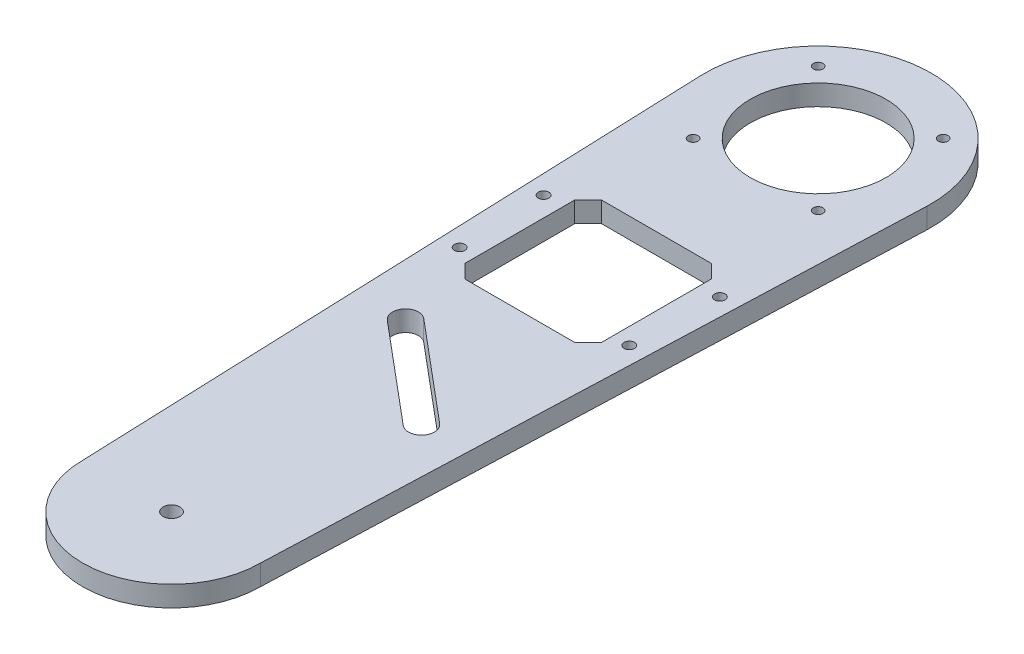
ISO-10303-21;
HEADER;
FILE_DESCRIPTION(('STEP AP214'),'2;1');
FILE_NAME('part.step','',(''),(''),'','','');
FILE_SCHEMA(('AUTOMOTIVE_DESIGN { 1 0 10303 214 1 1 1 1 }'));
ENDSEC;
DATA;
#1=APPLICATION_CONTEXT('core data for automotive mechanical design processes');
#2=APPLICATION_PROTOCOL_DEFINITION('international standard','automotive_design',2000,#1);
#3=PRODUCT_CONTEXT('',#1,'mechanical');
#4=PRODUCT('Part','Part','',(#3));
#5=PRODUCT_RELATED_PRODUCT_CATEGORY('part','',(#4));
#6=PRODUCT_DEFINITION_FORMATION('','',#4);
#7=PRODUCT_DEFINITION_CONTEXT('part definition',#1,'design');
#8=PRODUCT_DEFINITION('design','',#6,#7);
#9=PRODUCT_DEFINITION_SHAPE('','',#8);
#10=(LENGTH_UNIT() NAMED_UNIT(*) SI_UNIT(.MILLI.,.METRE.));
#11=(NAMED_UNIT(*) PLANE_ANGLE_UNIT() SI_UNIT($,.RADIAN.));
#12=(NAMED_UNIT(*) SI_UNIT($,.STERADIAN.) SOLID_ANGLE_UNIT());
#13=UNCERTAINTY_MEASURE_WITH_UNIT(LENGTH_MEASURE(1.E-05),#10,'distance_accuracy_value','');
#14=(GEOMETRIC_REPRESENTATION_CONTEXT(3) GLOBAL_UNCERTAINTY_ASSIGNED_CONTEXT((#13)) GLOBAL_UNIT_ASSIGNED_CONTEXT((#10,
#11,#12)) REPRESENTATION_CONTEXT('',''));
#15=CARTESIAN_POINT('',(0.,0.,0.));
#16=DIRECTION('',(0.,0.,1.));
#17=DIRECTION('',(1.,0.,0.));
#18=AXIS2_PLACEMENT_3D('',#15,#16,#17);
#19=CARTESIAN_POINT('',(27.4611273571522,6.35,1.03319242929476));
#20=DIRECTION('',(-0.999292974733131,0.,-0.0375972159741946));
#21=DIRECTION('',(-0.0375972159741946,0.,0.999292974733131));
#22=AXIS2_PLACEMENT_3D('',#19,#20,#21);
#23=PLANE('',#22);
#24=DIRECTION('',(0.0375972159741946,0.,-0.999292974733131));
#25=VECTOR('',#24,1.);
#26=CARTESIAN_POINT('',(27.4611273571522,0.,1.03319242929476));
#27=LINE('',#26,#25);
#28=CARTESIAN_POINT('',(27.5,0.,0.));
#29=VERTEX_POINT('',#28);
#30=CARTESIAN_POINT('',(34.9752541156596,0.,-198.684097440903));
#31=VERTEX_POINT('',#30);
#32=EDGE_CURVE('E312',#29,#31,#27,.T.);
#33=ORIENTED_EDGE('',*,*,#32,.T.);
#34=DIRECTION('',(0.,-1.,0.));
#35=VECTOR('',#34,1.);
#36=CARTESIAN_POINT('',(34.9752541156596,6.35,-198.684097440903));
#37=LINE('',#36,#35);
#38=CARTESIAN_POINT('',(34.9752541156596,6.35,-198.684097440903));
#39=VERTEX_POINT('',#38);
#40=EDGE_CURVE('E12',#39,#31,#37,.T.);
#41=ORIENTED_EDGE('',*,*,#40,.F.);
#42=DIRECTION('',(0.0375972159741946,0.,-0.999292974733131));
#43=VECTOR('',#42,1.);
#44=CARTESIAN_POINT('',(27.4611273571522,6.35,1.03319242929476));
#45=LINE('',#44,#43);
#46=CARTESIAN_POINT('',(27.5,6.35,0.));
#47=VERTEX_POINT('',#46);
#48=EDGE_CURVE('E318',#47,#39,#45,.T.);
#49=ORIENTED_EDGE('',*,*,#48,.F.);
#50=DIRECTION('',(0.,-1.,0.));
#51=VECTOR('',#50,1.);
#52=CARTESIAN_POINT('',(27.5,6.35,0.));
#53=LINE('',#52,#51);
#54=EDGE_CURVE('E336',#47,#29,#53,.T.);
#55=ORIENTED_EDGE('',*,*,#54,.T.);
#56=EDGE_LOOP('',(#33,#41,#49,#55));
#57=FACE_BOUND('',#56,.T.);
#58=ADVANCED_FACE('F44',(#57),#23,.F.);
#59=CARTESIAN_POINT('',(0.,6.35,-200.));
#60=DIRECTION('',(0.,-1.,0.));
#61=DIRECTION('',(0.,0.,-1.));
#62=AXIS2_PLACEMENT_3D('',#59,#60,#61);
#63=CYLINDRICAL_SURFACE('',#62,35.);
#64=CARTESIAN_POINT('',(0.,0.,-200.));
#65=DIRECTION('',(0.,1.,0.));
#66=DIRECTION('',(0.,0.,1.));
#67=AXIS2_PLACEMENT_3D('',#64,#65,#66);
#68=CIRCLE('',#67,35.);
#69=CARTESIAN_POINT('',(-34.9752541156596,0.,-198.684097440903));
#70=VERTEX_POINT('',#69);
#71=EDGE_CURVE('E340',#31,#70,#68,.T.);
#72=ORIENTED_EDGE('',*,*,#71,.T.);
#73=DIRECTION('',(0.,-1.,0.));
#74=VECTOR('',#73,1.);
#75=CARTESIAN_POINT('',(-34.9752541156596,6.35,-198.684097440903));
#76=LINE('',#75,#74);
#77=CARTESIAN_POINT('',(-34.9752541156596,6.35,-198.684097440903));
#78=VERTEX_POINT('',#77);
#79=EDGE_CURVE('E52',#78,#70,#76,.T.);
#80=ORIENTED_EDGE('',*,*,#79,.F.);
#81=CARTESIAN_POINT('',(0.,6.35,-200.));
#82=DIRECTION('',(0.,1.,0.));
#83=DIRECTION('',(0.,0.,1.));
#84=AXIS2_PLACEMENT_3D('',#81,#82,#83);
#85=CIRCLE('',#84,35.);
#86=EDGE_CURVE('E323',#39,#78,#85,.T.);
#87=ORIENTED_EDGE('',*,*,#86,.F.);
#88=ORIENTED_EDGE('',*,*,#40,.T.);
#89=EDGE_LOOP('',(#72,#80,#87,#88));
#90=FACE_BOUND('',#89,.T.);
#91=ADVANCED_FACE('F362',(#90),#63,.T.);
#92=CARTESIAN_POINT('',(-27.4611273571522,6.35,1.03319242929476));
#93=DIRECTION('',(-0.999292974733131,0.,0.0375972159741946));
#94=DIRECTION('',(0.0375972159741946,0.,0.999292974733131));
#95=AXIS2_PLACEMENT_3D('',#92,#93,#94);
#96=PLANE('',#95);
#97=DIRECTION('',(-0.0375972159741946,0.,-0.999292974733131));
#98=VECTOR('',#97,1.);
#99=CARTESIAN_POINT('',(-27.4611273571522,0.,1.03319242929476));
#100=LINE('',#99,#98);
#101=CARTESIAN_POINT('',(-27.5,0.,0.));
#102=VERTEX_POINT('',#101);
#103=EDGE_CURVE('E344',#102,#70,#100,.T.);
#104=ORIENTED_EDGE('',*,*,#103,.F.);
#105=DIRECTION('',(0.,-1.,0.));
#106=VECTOR('',#105,1.);
#107=CARTESIAN_POINT('',(-27.5,6.35,0.));
#108=LINE('',#107,#106);
#109=CARTESIAN_POINT('',(-27.5,6.35,0.));
#110=VERTEX_POINT('',#109);
#111=EDGE_CURVE('E353',#110,#102,#108,.T.);
#112=ORIENTED_EDGE('',*,*,#111,.F.);
#113=DIRECTION('',(-0.0375972159741946,0.,-0.999292974733131));
#114=VECTOR('',#113,1.);
#115=CARTESIAN_POINT('',(-27.4611273571522,6.35,1.03319242929476));
#116=LINE('',#115,#114);
#117=EDGE_CURVE('E328',#110,#78,#116,.T.);
#118=ORIENTED_EDGE('',*,*,#117,.T.);
#119=ORIENTED_EDGE('',*,*,#79,.T.);
#120=EDGE_LOOP('',(#104,#112,#118,#119));
#121=FACE_BOUND('',#120,.T.);
#122=ADVANCED_FACE('F359',(#121),#96,.T.);
#123=CARTESIAN_POINT('',(0.,6.35,0.));
#124=DIRECTION('',(0.,-1.,0.));
#125=DIRECTION('',(0.,0.,-1.));
#126=AXIS2_PLACEMENT_3D('',#123,#124,#125);
#127=CYLINDRICAL_SURFACE('',#126,27.5);
#128=CARTESIAN_POINT('',(0.,0.,0.));
#129=DIRECTION('',(0.,1.,0.));
#130=DIRECTION('',(0.,0.,1.));
#131=AXIS2_PLACEMENT_3D('',#128,#129,#130);
#132=CIRCLE('',#131,27.5);
#133=EDGE_CURVE('E324',#102,#29,#132,.T.);
#134=ORIENTED_EDGE('',*,*,#133,.T.);
#135=ORIENTED_EDGE('',*,*,#54,.F.);
#136=CARTESIAN_POINT('',(0.,6.35,0.));
#137=DIRECTION('',(0.,1.,0.));
#138=DIRECTION('',(0.,0.,1.));
#139=AXIS2_PLACEMENT_3D('',#136,#137,#138);
#140=CIRCLE('',#139,27.5);
#141=EDGE_CURVE('E332',#110,#47,#140,.T.);
#142=ORIENTED_EDGE('',*,*,#141,.F.);
#143=ORIENTED_EDGE('',*,*,#111,.T.);
#144=EDGE_LOOP('',(#134,#135,#142,#143));
#145=FACE_BOUND('',#144,.T.);
#146=ADVANCED_FACE('F369',(#145),#127,.T.);
#147=CARTESIAN_POINT('',(0.,6.35,0.));
#148=DIRECTION('',(0.,1.,0.));
#149=DIRECTION('',(0.,0.,1.));
#150=AXIS2_PLACEMENT_3D('',#147,#148,#149);
#151=PLANE('',#150);
#152=CARTESIAN_POINT('',(-15.3208888623795,6.35,-87.7));
#153=DIRECTION('',(0.,1.,0.));
#154=DIRECTION('',(0.,0.,1.));
#155=AXIS2_PLACEMENT_3D('',#152,#153,#154);
#156=CIRCLE('',#155,3.99999999999999);
#157=CARTESIAN_POINT('',(-12.7497384236334,6.35,-90.7641777724759));
#158=VERTEX_POINT('',#157);
#159=CARTESIAN_POINT('',(-17.8920393011257,6.35,-84.6358222275241));
#160=VERTEX_POINT('',#159);
#161=EDGE_CURVE('E59',#158,#160,#156,.T.);
#162=ORIENTED_EDGE('',*,*,#161,.F.);
#163=DIRECTION('',(-0.766044443118977,0.,-0.642787609686541));
#164=VECTOR('',#163,1.);
#165=CARTESIAN_POINT('',(-12.7497384236334,6.35,-90.7641777724759));
#166=LINE('',#165,#164);
#167=CARTESIAN_POINT('',(17.8920393011257,6.35,-65.0526733850143));
#168=VERTEX_POINT('',#167);
#169=EDGE_CURVE('E178',#168,#158,#166,.T.);
#170=ORIENTED_EDGE('',*,*,#169,.F.);
#171=CARTESIAN_POINT('',(15.3208888623795,6.35,-61.9884956125384));
#172=DIRECTION('',(0.,1.,0.));
#173=DIRECTION('',(0.,0.,1.));
#174=AXIS2_PLACEMENT_3D('',#171,#172,#173);
#175=CIRCLE('',#174,3.99999999999999);
#176=CARTESIAN_POINT('',(12.7497384236334,6.35,-58.9243178400625));
#177=VERTEX_POINT('',#176);
#178=EDGE_CURVE('E182',#177,#168,#175,.T.);
#179=ORIENTED_EDGE('',*,*,#178,.F.);
#180=DIRECTION('',(0.766044443118977,0.,0.642787609686541));
#181=VECTOR('',#180,1.);
#182=CARTESIAN_POINT('',(-17.8920393011257,6.35,-84.6358222275241));
#183=LINE('',#182,#181);
#184=EDGE_CURVE('E192',#160,#177,#183,.T.);
#185=ORIENTED_EDGE('',*,*,#184,.F.);
#186=EDGE_LOOP('',(#162,#170,#179,#185));
#187=FACE_BOUND('',#186,.T.);
#188=CARTESIAN_POINT('',(27.2564768235202,6.35,-142.340455158897));
#189=DIRECTION('',(0.,-1.,0.));
#190=DIRECTION('',(0.,0.,1.));
#191=AXIS2_PLACEMENT_3D('',#188,#189,#190);
#192=CIRCLE('',#191,1.625);
#193=CARTESIAN_POINT('',(27.2564768235202,6.35,-140.715455158897));
#194=VERTEX_POINT('',#193);
#195=EDGE_CURVE('E216',#194,#194,#192,.T.);
#196=ORIENTED_EDGE('',*,*,#195,.T.);
#197=EDGE_LOOP('',(#196));
#198=FACE_BOUND('',#197,.T.);
#199=CARTESIAN_POINT('',(26.2413519922169,6.35,-115.359544841103));
#200=DIRECTION('',(0.,-1.,0.));
#201=DIRECTION('',(0.,0.,1.));
#202=AXIS2_PLACEMENT_3D('',#199,#200,#201);
#203=CIRCLE('',#202,1.625);
#204=CARTESIAN_POINT('',(26.2413519922169,6.35,-113.734544841103));
#205=VERTEX_POINT('',#204);
#206=EDGE_CURVE('E205',#205,#205,#203,.T.);
#207=ORIENTED_EDGE('',*,*,#206,.T.);
#208=EDGE_LOOP('',(#207));
#209=FACE_BOUND('',#208,.T.);
#210=CARTESIAN_POINT('',(-27.2564768235202,6.35,-142.340455158897));
#211=DIRECTION('',(0.,1.,0.));
#212=DIRECTION('',(0.,0.,1.));
#213=AXIS2_PLACEMENT_3D('',#210,#211,#212);
#214=CIRCLE('',#213,1.625);
#215=CARTESIAN_POINT('',(-27.2564768235202,6.35,-140.715455158897));
#216=VERTEX_POINT('',#215);
#217=EDGE_CURVE('E236',#216,#216,#214,.T.);
#218=ORIENTED_EDGE('',*,*,#217,.F.);
#219=EDGE_LOOP('',(#218));
#220=FACE_BOUND('',#219,.T.);
#221=CARTESIAN_POINT('',(-26.2413519922169,6.35,-115.359544841103));
#222=DIRECTION('',(0.,1.,0.));
#223=DIRECTION('',(0.,0.,1.));
#224=AXIS2_PLACEMENT_3D('',#221,#222,#223);
#225=CIRCLE('',#224,1.625);
#226=CARTESIAN_POINT('',(-26.2413519922169,6.35,-113.734544841103));
#227=VERTEX_POINT('',#226);
#228=EDGE_CURVE('E215',#227,#227,#225,.T.);
#229=ORIENTED_EDGE('',*,*,#228,.F.);
#230=EDGE_LOOP('',(#229));
#231=FACE_BOUND('',#230,.T.);
#232=DIRECTION('',(-0.707106781186548,0.,-0.707106781186547));
#233=VECTOR('',#232,1.);
#234=CARTESIAN_POINT('',(16.9780699909994,6.35,-150.));
#235=LINE('',#234,#233);
#236=CARTESIAN_POINT('',(21.15,6.35,-145.828069990999));
#237=VERTEX_POINT('',#236);
#238=CARTESIAN_POINT('',(16.9780699909994,6.35,-150.));
#239=VERTEX_POINT('',#238);
#240=EDGE_CURVE('E235',#237,#239,#235,.T.);
#241=ORIENTED_EDGE('',*,*,#240,.F.);
#242=DIRECTION('',(0.,0.,-1.));
#243=VECTOR('',#242,1.);
#244=CARTESIAN_POINT('',(21.15,6.35,-145.828069990999));
#245=LINE('',#244,#243);
#246=CARTESIAN_POINT('',(21.15,6.35,-111.871930009001));
#247=VERTEX_POINT('',#246);
#248=EDGE_CURVE('E444',#247,#237,#245,.T.);
#249=ORIENTED_EDGE('',*,*,#248,.F.);
#250=DIRECTION('',(0.707106781186547,0.,-0.707106781186548));
#251=VECTOR('',#250,1.);
#252=CARTESIAN_POINT('',(21.15,6.35,-111.871930009001));
#253=LINE('',#252,#251);
#254=CARTESIAN_POINT('',(16.9780699909994,6.35,-107.7));
#255=VERTEX_POINT('',#254);
#256=EDGE_CURVE('E447',#255,#247,#253,.T.);
#257=ORIENTED_EDGE('',*,*,#256,.F.);
#258=DIRECTION('',(1.,0.,0.));
#259=VECTOR('',#258,1.);
#260=CARTESIAN_POINT('',(16.9780699909994,6.35,-107.7));
#261=LINE('',#260,#259);
#262=CARTESIAN_POINT('',(-16.9780699909994,6.35,-107.7));
#263=VERTEX_POINT('',#262);
#264=EDGE_CURVE('E450',#263,#255,#261,.T.);
#265=ORIENTED_EDGE('',*,*,#264,.F.);
#266=DIRECTION('',(0.707106781186555,0.,0.70710678118654));
#267=VECTOR('',#266,1.);
#268=CARTESIAN_POINT('',(-16.9780699909994,6.35,-107.7));
#269=LINE('',#268,#267);
#270=CARTESIAN_POINT('',(-21.15,6.35,-111.871930009001));
#271=VERTEX_POINT('',#270);
#272=EDGE_CURVE('E454',#271,#263,#269,.T.);
#273=ORIENTED_EDGE('',*,*,#272,.F.);
#274=DIRECTION('',(0.,0.,1.));
#275=VECTOR('',#274,1.);
#276=CARTESIAN_POINT('',(-21.15,6.35,-111.871930009001));
#277=LINE('',#276,#275);
#278=CARTESIAN_POINT('',(-21.15,6.35,-145.828069990999));
#279=VERTEX_POINT('',#278);
#280=EDGE_CURVE('E458',#279,#271,#277,.T.);
#281=ORIENTED_EDGE('',*,*,#280,.F.);
#282=DIRECTION('',(-0.707106781186548,0.,0.707106781186547));
#283=VECTOR('',#282,1.);
#284=CARTESIAN_POINT('',(-21.15,6.35,-145.828069990999));
#285=LINE('',#284,#283);
#286=CARTESIAN_POINT('',(-16.9780699909994,6.35,-150.));
#287=VERTEX_POINT('',#286);
#288=EDGE_CURVE('E267',#287,#279,#285,.T.);
#289=ORIENTED_EDGE('',*,*,#288,.F.);
#290=DIRECTION('',(-1.,0.,0.));
#291=VECTOR('',#290,1.);
#292=CARTESIAN_POINT('',(-16.9780699909994,6.35,-150.));
#293=LINE('',#292,#291);
#294=EDGE_CURVE('E260',#239,#287,#293,.T.);
#295=ORIENTED_EDGE('',*,*,#294,.F.);
#296=EDGE_LOOP('',(#241,#249,#257,#265,#273,#281,#289,#295));
#297=FACE_BOUND('',#296,.T.);
#298=CARTESIAN_POINT('',(-19.3393704654521,6.35,-180.660629534548));
#299=DIRECTION('',(0.,1.,0.));
#300=DIRECTION('',(0.,0.,1.));
#301=AXIS2_PLACEMENT_3D('',#298,#299,#300);
#302=CIRCLE('',#301,1.5);
#303=CARTESIAN_POINT('',(-19.3393704654521,6.35,-179.160629534548));
#304=VERTEX_POINT('',#303);
#305=EDGE_CURVE('E278',#304,#304,#302,.T.);
#306=ORIENTED_EDGE('',*,*,#305,.F.);
#307=EDGE_LOOP('',(#306));
#308=FACE_BOUND('',#307,.T.);
#309=CARTESIAN_POINT('',(19.3393704654521,6.35,-180.660629534548));
#310=DIRECTION('',(0.,1.,0.));
#311=DIRECTION('',(0.,0.,1.));
#312=AXIS2_PLACEMENT_3D('',#309,#310,#311);
#313=CIRCLE('',#312,1.5);
#314=CARTESIAN_POINT('',(19.3393704654521,6.35,-179.160629534548));
#315=VERTEX_POINT('',#314);
#316=EDGE_CURVE('E388',#315,#315,#313,.T.);
#317=ORIENTED_EDGE('',*,*,#316,.F.);
#318=EDGE_LOOP('',(#317));
#319=FACE_BOUND('',#318,.T.);
#320=CARTESIAN_POINT('',(19.3393704654521,6.35,-219.339370465452));
#321=DIRECTION('',(0.,1.,0.));
#322=DIRECTION('',(0.,0.,1.));
#323=AXIS2_PLACEMENT_3D('',#320,#321,#322);
#324=CIRCLE('',#323,1.5);
#325=CARTESIAN_POINT('',(19.3393704654521,6.35,-217.839370465452));
#326=VERTEX_POINT('',#325);
#327=EDGE_CURVE('E381',#326,#326,#324,.T.);
#328=ORIENTED_EDGE('',*,*,#327,.F.);
#329=EDGE_LOOP('',(#328));
#330=FACE_BOUND('',#329,.T.);
#331=CARTESIAN_POINT('',(-19.3393704654521,6.35,-219.339370465452));
#332=DIRECTION('',(0.,1.,0.));
#333=DIRECTION('',(0.,0.,1.));
#334=AXIS2_PLACEMENT_3D('',#331,#332,#333);
#335=CIRCLE('',#334,1.5);
#336=CARTESIAN_POINT('',(-19.3393704654521,6.35,-217.839370465452));
#337=VERTEX_POINT('',#336);
#338=EDGE_CURVE('E291',#337,#337,#335,.T.);
#339=ORIENTED_EDGE('',*,*,#338,.F.);
#340=EDGE_LOOP('',(#339));
#341=FACE_BOUND('',#340,.T.);
#342=CARTESIAN_POINT('',(0.,6.35,-200.));
#343=DIRECTION('',(0.,1.,0.));
#344=DIRECTION('',(0.,0.,1.));
#345=AXIS2_PLACEMENT_3D('',#342,#343,#344);
#346=CIRCLE('',#345,21.);
#347=CARTESIAN_POINT('',(0.,6.35,-179.));
#348=VERTEX_POINT('',#347);
#349=EDGE_CURVE('E290',#348,#348,#346,.T.);
#350=ORIENTED_EDGE('',*,*,#349,.F.);
#351=EDGE_LOOP('',(#350));
#352=FACE_BOUND('',#351,.T.);
#353=CARTESIAN_POINT('',(0.,6.35,0.));
#354=DIRECTION('',(0.,1.,0.));
#355=DIRECTION('',(0.,0.,1.));
#356=AXIS2_PLACEMENT_3D('',#353,#354,#355);
#357=CIRCLE('',#356,2.6);
#358=CARTESIAN_POINT('',(0.,6.35,2.6));
#359=VERTEX_POINT('',#358);
#360=EDGE_CURVE('E313',#359,#359,#357,.T.);
#361=ORIENTED_EDGE('',*,*,#360,.F.);
#362=EDGE_LOOP('',(#361));
#363=FACE_BOUND('',#362,.T.);
#364=ORIENTED_EDGE('',*,*,#48,.T.);
#365=ORIENTED_EDGE('',*,*,#86,.T.);
#366=ORIENTED_EDGE('',*,*,#117,.F.);
#367=ORIENTED_EDGE('',*,*,#141,.T.);
#368=EDGE_LOOP('',(#364,#365,#366,#367));
#369=FACE_BOUND('',#368,.T.);
#370=ADVANCED_FACE('F374',(#187,#198,#209,#220,#231,#297,#308,#319,#330,#341,#352,#363,#369),
#151,.T.);
#371=CARTESIAN_POINT('',(0.,0.,0.));
#372=DIRECTION('',(0.,1.,0.));
#373=DIRECTION('',(0.,0.,1.));
#374=AXIS2_PLACEMENT_3D('',#371,#372,#373);
#375=PLANE('',#374);
#376=DIRECTION('',(-0.766044443118977,0.,-0.642787609686541));
#377=VECTOR('',#376,1.);
#378=CARTESIAN_POINT('',(-12.7497384236334,0.,-90.7641777724759));
#379=LINE('',#378,#377);
#380=CARTESIAN_POINT('',(17.8920393011257,0.,-65.0526733850143));
#381=VERTEX_POINT('',#380);
#382=CARTESIAN_POINT('',(-12.7497384236334,0.,-90.7641777724759));
#383=VERTEX_POINT('',#382);
#384=EDGE_CURVE('E166',#381,#383,#379,.T.);
#385=ORIENTED_EDGE('',*,*,#384,.T.);
#386=CARTESIAN_POINT('',(-15.3208888623795,0.,-87.7));
#387=DIRECTION('',(0.,1.,0.));
#388=DIRECTION('',(0.,0.,1.));
#389=AXIS2_PLACEMENT_3D('',#386,#387,#388);
#390=CIRCLE('',#389,3.99999999999999);
#391=CARTESIAN_POINT('',(-17.8920393011257,0.,-84.6358222275241));
#392=VERTEX_POINT('',#391);
#393=EDGE_CURVE('E159',#383,#392,#390,.T.);
#394=ORIENTED_EDGE('',*,*,#393,.T.);
#395=DIRECTION('',(0.766044443118977,0.,0.642787609686541));
#396=VECTOR('',#395,1.);
#397=CARTESIAN_POINT('',(-17.8920393011257,0.,-84.6358222275241));
#398=LINE('',#397,#396);
#399=CARTESIAN_POINT('',(12.7497384236334,0.,-58.9243178400625));
#400=VERTEX_POINT('',#399);
#401=EDGE_CURVE('E169',#392,#400,#398,.T.);
#402=ORIENTED_EDGE('',*,*,#401,.T.);
#403=CARTESIAN_POINT('',(15.3208888623795,0.,-61.9884956125384));
#404=DIRECTION('',(0.,1.,0.));
#405=DIRECTION('',(0.,0.,1.));
#406=AXIS2_PLACEMENT_3D('',#403,#404,#405);
#407=CIRCLE('',#406,3.99999999999999);
#408=EDGE_CURVE('E67',#400,#381,#407,.T.);
#409=ORIENTED_EDGE('',*,*,#408,.T.);
#410=EDGE_LOOP('',(#385,#394,#402,#409));
#411=FACE_BOUND('',#410,.T.);
#412=CARTESIAN_POINT('',(27.2564768235202,0.,-142.340455158897));
#413=DIRECTION('',(0.,-1.,0.));
#414=DIRECTION('',(0.,0.,1.));
#415=AXIS2_PLACEMENT_3D('',#412,#413,#414);
#416=CIRCLE('',#415,1.625);
#417=CARTESIAN_POINT('',(27.2564768235202,0.,-140.715455158897));
#418=VERTEX_POINT('',#417);
#419=EDGE_CURVE('E211',#418,#418,#416,.T.);
#420=ORIENTED_EDGE('',*,*,#419,.F.);
#421=EDGE_LOOP('',(#420));
#422=FACE_BOUND('',#421,.T.);
#423=CARTESIAN_POINT('',(26.2413519922169,0.,-115.359544841103));
#424=DIRECTION('',(0.,-1.,0.));
#425=DIRECTION('',(0.,0.,1.));
#426=AXIS2_PLACEMENT_3D('',#423,#424,#425);
#427=CIRCLE('',#426,1.625);
#428=CARTESIAN_POINT('',(26.2413519922169,0.,-113.734544841103));
#429=VERTEX_POINT('',#428);
#430=EDGE_CURVE('E221',#429,#429,#427,.T.);
#431=ORIENTED_EDGE('',*,*,#430,.F.);
#432=EDGE_LOOP('',(#431));
#433=FACE_BOUND('',#432,.T.);
#434=CARTESIAN_POINT('',(-27.2564768235202,0.,-142.340455158897));
#435=DIRECTION('',(0.,1.,0.));
#436=DIRECTION('',(0.,0.,1.));
#437=AXIS2_PLACEMENT_3D('',#434,#435,#436);
#438=CIRCLE('',#437,1.625);
#439=CARTESIAN_POINT('',(-27.2564768235202,0.,-140.715455158897));
#440=VERTEX_POINT('',#439);
#441=EDGE_CURVE('E232',#440,#440,#438,.T.);
#442=ORIENTED_EDGE('',*,*,#441,.T.);
#443=EDGE_LOOP('',(#442));
#444=FACE_BOUND('',#443,.T.);
#445=CARTESIAN_POINT('',(-26.2413519922169,0.,-115.359544841103));
#446=DIRECTION('',(0.,1.,0.));
#447=DIRECTION('',(0.,0.,1.));
#448=AXIS2_PLACEMENT_3D('',#445,#446,#447);
#449=CIRCLE('',#448,1.625);
#450=CARTESIAN_POINT('',(-26.2413519922169,0.,-113.734544841103));
#451=VERTEX_POINT('',#450);
#452=EDGE_CURVE('E241',#451,#451,#449,.T.);
#453=ORIENTED_EDGE('',*,*,#452,.T.);
#454=EDGE_LOOP('',(#453));
#455=FACE_BOUND('',#454,.T.);
#456=DIRECTION('',(0.,0.,-1.));
#457=VECTOR('',#456,1.);
#458=CARTESIAN_POINT('',(21.15,0.,-145.828069990999));
#459=LINE('',#458,#457);
#460=CARTESIAN_POINT('',(21.15,0.,-111.871930009001));
#461=VERTEX_POINT('',#460);
#462=CARTESIAN_POINT('',(21.15,0.,-145.828069990999));
#463=VERTEX_POINT('',#462);
#464=EDGE_CURVE('E261',#461,#463,#459,.T.);
#465=ORIENTED_EDGE('',*,*,#464,.T.);
#466=DIRECTION('',(-0.707106781186548,0.,-0.707106781186547));
#467=VECTOR('',#466,1.);
#468=CARTESIAN_POINT('',(16.9780699909994,0.,-150.));
#469=LINE('',#468,#467);
#470=CARTESIAN_POINT('',(16.9780699909994,0.,-150.));
#471=VERTEX_POINT('',#470);
#472=EDGE_CURVE('E249',#463,#471,#469,.T.);
#473=ORIENTED_EDGE('',*,*,#472,.T.);
#474=DIRECTION('',(-1.,0.,0.));
#475=VECTOR('',#474,1.);
#476=CARTESIAN_POINT('',(-16.9780699909994,0.,-150.));
#477=LINE('',#476,#475);
#478=CARTESIAN_POINT('',(-16.9780699909994,0.,-150.));
#479=VERTEX_POINT('',#478);
#480=EDGE_CURVE('E438',#471,#479,#477,.T.);
#481=ORIENTED_EDGE('',*,*,#480,.T.);
#482=DIRECTION('',(-0.707106781186548,0.,0.707106781186547));
#483=VECTOR('',#482,1.);
#484=CARTESIAN_POINT('',(-21.15,0.,-145.828069990999));
#485=LINE('',#484,#483);
#486=CARTESIAN_POINT('',(-21.15,0.,-145.828069990999));
#487=VERTEX_POINT('',#486);
#488=EDGE_CURVE('E434',#479,#487,#485,.T.);
#489=ORIENTED_EDGE('',*,*,#488,.T.);
#490=DIRECTION('',(0.,0.,1.));
#491=VECTOR('',#490,1.);
#492=CARTESIAN_POINT('',(-21.15,0.,-111.871930009001));
#493=LINE('',#492,#491);
#494=CARTESIAN_POINT('',(-21.15,0.,-111.871930009001));
#495=VERTEX_POINT('',#494);
#496=EDGE_CURVE('E430',#487,#495,#493,.T.);
#497=ORIENTED_EDGE('',*,*,#496,.T.);
#498=DIRECTION('',(0.707106781186555,0.,0.70710678118654));
#499=VECTOR('',#498,1.);
#500=CARTESIAN_POINT('',(-16.9780699909994,0.,-107.7));
#501=LINE('',#500,#499);
#502=CARTESIAN_POINT('',(-16.9780699909994,0.,-107.7));
#503=VERTEX_POINT('',#502);
#504=EDGE_CURVE('E426',#495,#503,#501,.T.);
#505=ORIENTED_EDGE('',*,*,#504,.T.);
#506=DIRECTION('',(1.,0.,0.));
#507=VECTOR('',#506,1.);
#508=CARTESIAN_POINT('',(16.9780699909994,0.,-107.7));
#509=LINE('',#508,#507);
#510=CARTESIAN_POINT('',(16.9780699909994,0.,-107.7));
#511=VERTEX_POINT('',#510);
#512=EDGE_CURVE('E423',#503,#511,#509,.T.);
#513=ORIENTED_EDGE('',*,*,#512,.T.);
#514=DIRECTION('',(0.707106781186547,0.,-0.707106781186548));
#515=VECTOR('',#514,1.);
#516=CARTESIAN_POINT('',(21.15,0.,-111.871930009001));
#517=LINE('',#516,#515);
#518=EDGE_CURVE('E420',#511,#461,#517,.T.);
#519=ORIENTED_EDGE('',*,*,#518,.T.);
#520=EDGE_LOOP('',(#465,#473,#481,#489,#497,#505,#513,#519));
#521=FACE_BOUND('',#520,.T.);
#522=CARTESIAN_POINT('',(-19.3393704654521,0.,-180.660629534548));
#523=DIRECTION('',(0.,1.,0.));
#524=DIRECTION('',(0.,0.,1.));
#525=AXIS2_PLACEMENT_3D('',#522,#523,#524);
#526=CIRCLE('',#525,1.5);
#527=CARTESIAN_POINT('',(-19.3393704654521,0.,-179.160629534548));
#528=VERTEX_POINT('',#527);
#529=EDGE_CURVE('E284',#528,#528,#526,.T.);
#530=ORIENTED_EDGE('',*,*,#529,.T.);
#531=EDGE_LOOP('',(#530));
#532=FACE_BOUND('',#531,.T.);
#533=CARTESIAN_POINT('',(19.3393704654521,0.,-180.660629534548));
#534=DIRECTION('',(0.,1.,0.));
#535=DIRECTION('',(0.,0.,1.));
#536=AXIS2_PLACEMENT_3D('',#533,#534,#535);
#537=CIRCLE('',#536,1.5);
#538=CARTESIAN_POINT('',(19.3393704654521,0.,-179.160629534548));
#539=VERTEX_POINT('',#538);
#540=EDGE_CURVE('E385',#539,#539,#537,.T.);
#541=ORIENTED_EDGE('',*,*,#540,.T.);
#542=EDGE_LOOP('',(#541));
#543=FACE_BOUND('',#542,.T.);
#544=CARTESIAN_POINT('',(19.3393704654521,0.,-219.339370465452));
#545=DIRECTION('',(0.,1.,0.));
#546=DIRECTION('',(0.,0.,1.));
#547=AXIS2_PLACEMENT_3D('',#544,#545,#546);
#548=CIRCLE('',#547,1.5);
#549=CARTESIAN_POINT('',(19.3393704654521,0.,-217.839370465452));
#550=VERTEX_POINT('',#549);
#551=EDGE_CURVE('E296',#550,#550,#548,.T.);
#552=ORIENTED_EDGE('',*,*,#551,.T.);
#553=EDGE_LOOP('',(#552));
#554=FACE_BOUND('',#553,.T.);
#555=CARTESIAN_POINT('',(-19.3393704654521,0.,-219.339370465452));
#556=DIRECTION('',(0.,1.,0.));
#557=DIRECTION('',(0.,0.,1.));
#558=AXIS2_PLACEMENT_3D('',#555,#556,#557);
#559=CIRCLE('',#558,1.5);
#560=CARTESIAN_POINT('',(-19.3393704654521,0.,-217.839370465452));
#561=VERTEX_POINT('',#560);
#562=EDGE_CURVE('E286',#561,#561,#559,.T.);
#563=ORIENTED_EDGE('',*,*,#562,.T.);
#564=EDGE_LOOP('',(#563));
#565=FACE_BOUND('',#564,.T.);
#566=CARTESIAN_POINT('',(0.,0.,-200.));
#567=DIRECTION('',(0.,1.,0.));
#568=DIRECTION('',(0.,0.,1.));
#569=AXIS2_PLACEMENT_3D('',#566,#567,#568);
#570=CIRCLE('',#569,21.);
#571=CARTESIAN_POINT('',(0.,0.,-179.));
#572=VERTEX_POINT('',#571);
#573=EDGE_CURVE('E297',#572,#572,#570,.T.);
#574=ORIENTED_EDGE('',*,*,#573,.T.);
#575=EDGE_LOOP('',(#574));
#576=FACE_BOUND('',#575,.T.);
#577=CARTESIAN_POINT('',(0.,0.,0.));
#578=DIRECTION('',(0.,1.,0.));
#579=DIRECTION('',(0.,0.,1.));
#580=AXIS2_PLACEMENT_3D('',#577,#578,#579);
#581=CIRCLE('',#580,2.6);
#582=CARTESIAN_POINT('',(0.,0.,2.6));
#583=VERTEX_POINT('',#582);
#584=EDGE_CURVE('E309',#583,#583,#581,.T.);
#585=ORIENTED_EDGE('',*,*,#584,.T.);
#586=EDGE_LOOP('',(#585));
#587=FACE_BOUND('',#586,.T.);
#588=ORIENTED_EDGE('',*,*,#32,.F.);
#589=ORIENTED_EDGE('',*,*,#133,.F.);
#590=ORIENTED_EDGE('',*,*,#103,.T.);
#591=ORIENTED_EDGE('',*,*,#71,.F.);
#592=EDGE_LOOP('',(#588,#589,#590,#591));
#593=FACE_BOUND('',#592,.T.);
#594=ADVANCED_FACE('F174',(#411,#422,#433,#444,#455,#521,#532,#543,#554,#565,#576,#587,#593),
#375,.F.);
#595=CARTESIAN_POINT('',(0.,0.,0.));
#596=DIRECTION('',(0.,1.,0.));
#597=DIRECTION('',(0.,0.,1.));
#598=AXIS2_PLACEMENT_3D('',#595,#596,#597);
#599=CYLINDRICAL_SURFACE('',#598,2.6);
#600=ORIENTED_EDGE('',*,*,#584,.F.);
#601=EDGE_LOOP('',(#600));
#602=FACE_BOUND('',#601,.T.);
#603=ORIENTED_EDGE('',*,*,#360,.T.);
#604=EDGE_LOOP('',(#603));
#605=FACE_BOUND('',#604,.T.);
#606=ADVANCED_FACE('F472',(#602,#605),#599,.F.);
#607=CARTESIAN_POINT('',(0.,0.,-200.));
#608=DIRECTION('',(0.,1.,0.));
#609=DIRECTION('',(0.,0.,1.));
#610=AXIS2_PLACEMENT_3D('',#607,#608,#609);
#611=CYLINDRICAL_SURFACE('',#610,21.);
#612=ORIENTED_EDGE('',*,*,#573,.F.);
#613=EDGE_LOOP('',(#612));
#614=FACE_BOUND('',#613,.T.);
#615=ORIENTED_EDGE('',*,*,#349,.T.);
#616=EDGE_LOOP('',(#615));
#617=FACE_BOUND('',#616,.T.);
#618=ADVANCED_FACE('F494',(#614,#617),#611,.F.);
#619=CARTESIAN_POINT('',(-19.3393704654521,0.,-219.339370465452));
#620=DIRECTION('',(0.,1.,0.));
#621=DIRECTION('',(0.,0.,1.));
#622=AXIS2_PLACEMENT_3D('',#619,#620,#621);
#623=CYLINDRICAL_SURFACE('',#622,1.5);
#624=ORIENTED_EDGE('',*,*,#562,.F.);
#625=EDGE_LOOP('',(#624));
#626=FACE_BOUND('',#625,.T.);
#627=ORIENTED_EDGE('',*,*,#338,.T.);
#628=EDGE_LOOP('',(#627));
#629=FACE_BOUND('',#628,.T.);
#630=ADVANCED_FACE('F537',(#626,#629),#623,.F.);
#631=CARTESIAN_POINT('',(19.3393704654521,0.,-219.339370465452));
#632=DIRECTION('',(0.,1.,0.));
#633=DIRECTION('',(0.,0.,1.));
#634=AXIS2_PLACEMENT_3D('',#631,#632,#633);
#635=CYLINDRICAL_SURFACE('',#634,1.5);
#636=ORIENTED_EDGE('',*,*,#551,.F.);
#637=EDGE_LOOP('',(#636));
#638=FACE_BOUND('',#637,.T.);
#639=ORIENTED_EDGE('',*,*,#327,.T.);
#640=EDGE_LOOP('',(#639));
#641=FACE_BOUND('',#640,.T.);
#642=ADVANCED_FACE('F547',(#638,#641),#635,.F.);
#643=CARTESIAN_POINT('',(19.3393704654521,0.,-180.660629534548));
#644=DIRECTION('',(0.,1.,0.));
#645=DIRECTION('',(0.,0.,1.));
#646=AXIS2_PLACEMENT_3D('',#643,#644,#645);
#647=CYLINDRICAL_SURFACE('',#646,1.5);
#648=ORIENTED_EDGE('',*,*,#540,.F.);
#649=EDGE_LOOP('',(#648));
#650=FACE_BOUND('',#649,.T.);
#651=ORIENTED_EDGE('',*,*,#316,.T.);
#652=EDGE_LOOP('',(#651));
#653=FACE_BOUND('',#652,.T.);
#654=ADVANCED_FACE('F557',(#650,#653),#647,.F.);
#655=CARTESIAN_POINT('',(-19.3393704654521,0.,-180.660629534548));
#656=DIRECTION('',(0.,1.,0.));
#657=DIRECTION('',(0.,0.,1.));
#658=AXIS2_PLACEMENT_3D('',#655,#656,#657);
#659=CYLINDRICAL_SURFACE('',#658,1.5);
#660=ORIENTED_EDGE('',*,*,#529,.F.);
#661=EDGE_LOOP('',(#660));
#662=FACE_BOUND('',#661,.T.);
#663=ORIENTED_EDGE('',*,*,#305,.T.);
#664=EDGE_LOOP('',(#663));
#665=FACE_BOUND('',#664,.T.);
#666=ADVANCED_FACE('F567',(#662,#665),#659,.F.);
#667=CARTESIAN_POINT('',(16.9780699909994,0.,-150.));
#668=DIRECTION('',(0.707106781186547,0.,-0.707106781186548));
#669=DIRECTION('',(-0.707106781186548,0.,-0.707106781186547));
#670=AXIS2_PLACEMENT_3D('',#667,#668,#669);
#671=PLANE('',#670);
#672=ORIENTED_EDGE('',*,*,#240,.T.);
#673=DIRECTION('',(0.,1.,0.));
#674=VECTOR('',#673,1.);
#675=CARTESIAN_POINT('',(16.9780699909994,0.,-150.));
#676=LINE('',#675,#674);
#677=EDGE_CURVE('E413',#471,#239,#676,.T.);
#678=ORIENTED_EDGE('',*,*,#677,.F.);
#679=ORIENTED_EDGE('',*,*,#472,.F.);
#680=DIRECTION('',(0.,1.,0.));
#681=VECTOR('',#680,1.);
#682=CARTESIAN_POINT('',(21.15,0.,-145.828069990999));
#683=LINE('',#682,#681);
#684=EDGE_CURVE('E285',#463,#237,#683,.T.);
#685=ORIENTED_EDGE('',*,*,#684,.T.);
#686=EDGE_LOOP('',(#672,#678,#679,#685));
#687=FACE_BOUND('',#686,.T.);
#688=ADVANCED_FACE('F577',(#687),#671,.F.);
#689=CARTESIAN_POINT('',(21.15,0.,-145.828069990999));
#690=DIRECTION('',(1.,0.,0.));
#691=DIRECTION('',(0.,0.,-1.));
#692=AXIS2_PLACEMENT_3D('',#689,#690,#691);
#693=PLANE('',#692);
#694=ORIENTED_EDGE('',*,*,#248,.T.);
#695=ORIENTED_EDGE('',*,*,#684,.F.);
#696=ORIENTED_EDGE('',*,*,#464,.F.);
#697=DIRECTION('',(0.,1.,0.));
#698=VECTOR('',#697,1.);
#699=CARTESIAN_POINT('',(21.15,0.,-111.871930009001));
#700=LINE('',#699,#698);
#701=EDGE_CURVE('E395',#461,#247,#700,.T.);
#702=ORIENTED_EDGE('',*,*,#701,.T.);
#703=EDGE_LOOP('',(#694,#695,#696,#702));
#704=FACE_BOUND('',#703,.T.);
#705=ADVANCED_FACE('F587',(#704),#693,.F.);
#706=CARTESIAN_POINT('',(21.15,0.,-111.871930009001));
#707=DIRECTION('',(0.707106781186548,0.,0.707106781186547));
#708=DIRECTION('',(0.707106781186547,0.,-0.707106781186548));
#709=AXIS2_PLACEMENT_3D('',#706,#707,#708);
#710=PLANE('',#709);
#711=ORIENTED_EDGE('',*,*,#256,.T.);
#712=ORIENTED_EDGE('',*,*,#701,.F.);
#713=ORIENTED_EDGE('',*,*,#518,.F.);
#714=DIRECTION('',(0.,1.,0.));
#715=VECTOR('',#714,1.);
#716=CARTESIAN_POINT('',(16.9780699909994,0.,-107.7));
#717=LINE('',#716,#715);
#718=EDGE_CURVE('E398',#511,#255,#717,.T.);
#719=ORIENTED_EDGE('',*,*,#718,.T.);
#720=EDGE_LOOP('',(#711,#712,#713,#719));
#721=FACE_BOUND('',#720,.T.);
#722=ADVANCED_FACE('F597',(#721),#710,.F.);
#723=CARTESIAN_POINT('',(16.9780699909994,0.,-107.7));
#724=DIRECTION('',(0.,0.,1.));
#725=DIRECTION('',(1.,0.,0.));
#726=AXIS2_PLACEMENT_3D('',#723,#724,#725);
#727=PLANE('',#726);
#728=ORIENTED_EDGE('',*,*,#264,.T.);
#729=ORIENTED_EDGE('',*,*,#718,.F.);
#730=ORIENTED_EDGE('',*,*,#512,.F.);
#731=DIRECTION('',(0.,1.,0.));
#732=VECTOR('',#731,1.);
#733=CARTESIAN_POINT('',(-16.9780699909994,0.,-107.7));
#734=LINE('',#733,#732);
#735=EDGE_CURVE('E401',#503,#263,#734,.T.);
#736=ORIENTED_EDGE('',*,*,#735,.T.);
#737=EDGE_LOOP('',(#728,#729,#730,#736));
#738=FACE_BOUND('',#737,.T.);
#739=ADVANCED_FACE('F607',(#738),#727,.F.);
#740=CARTESIAN_POINT('',(-16.9780699909994,0.,-107.7));
#741=DIRECTION('',(-0.70710678118654,0.,0.707106781186555));
#742=DIRECTION('',(0.707106781186555,0.,0.70710678118654));
#743=AXIS2_PLACEMENT_3D('',#740,#741,#742);
#744=PLANE('',#743);
#745=ORIENTED_EDGE('',*,*,#272,.T.);
#746=ORIENTED_EDGE('',*,*,#735,.F.);
#747=ORIENTED_EDGE('',*,*,#504,.F.);
#748=DIRECTION('',(0.,1.,0.));
#749=VECTOR('',#748,1.);
#750=CARTESIAN_POINT('',(-21.15,0.,-111.871930009001));
#751=LINE('',#750,#749);
#752=EDGE_CURVE('E404',#495,#271,#751,.T.);
#753=ORIENTED_EDGE('',*,*,#752,.T.);
#754=EDGE_LOOP('',(#745,#746,#747,#753));
#755=FACE_BOUND('',#754,.T.);
#756=ADVANCED_FACE('F617',(#755),#744,.F.);
#757=CARTESIAN_POINT('',(-21.15,0.,-111.871930009001));
#758=DIRECTION('',(-1.,0.,0.));
#759=DIRECTION('',(0.,0.,1.));
#760=AXIS2_PLACEMENT_3D('',#757,#758,#759);
#761=PLANE('',#760);
#762=ORIENTED_EDGE('',*,*,#280,.T.);
#763=ORIENTED_EDGE('',*,*,#752,.F.);
#764=ORIENTED_EDGE('',*,*,#496,.F.);
#765=DIRECTION('',(0.,1.,0.));
#766=VECTOR('',#765,1.);
#767=CARTESIAN_POINT('',(-21.15,0.,-145.828069990999));
#768=LINE('',#767,#766);
#769=EDGE_CURVE('E407',#487,#279,#768,.T.);
#770=ORIENTED_EDGE('',*,*,#769,.T.);
#771=EDGE_LOOP('',(#762,#763,#764,#770));
#772=FACE_BOUND('',#771,.T.);
#773=ADVANCED_FACE('F627',(#772),#761,.F.);
#774=CARTESIAN_POINT('',(-21.15,0.,-145.828069990999));
#775=DIRECTION('',(-0.707106781186547,0.,-0.707106781186548));
#776=DIRECTION('',(-0.707106781186548,0.,0.707106781186547));
#777=AXIS2_PLACEMENT_3D('',#774,#775,#776);
#778=PLANE('',#777);
#779=ORIENTED_EDGE('',*,*,#288,.T.);
#780=ORIENTED_EDGE('',*,*,#769,.F.);
#781=ORIENTED_EDGE('',*,*,#488,.F.);
#782=DIRECTION('',(0.,1.,0.));
#783=VECTOR('',#782,1.);
#784=CARTESIAN_POINT('',(-16.9780699909994,0.,-150.));
#785=LINE('',#784,#783);
#786=EDGE_CURVE('E410',#479,#287,#785,.T.);
#787=ORIENTED_EDGE('',*,*,#786,.T.);
#788=EDGE_LOOP('',(#779,#780,#781,#787));
#789=FACE_BOUND('',#788,.T.);
#790=ADVANCED_FACE('F637',(#789),#778,.F.);
#791=CARTESIAN_POINT('',(-16.9780699909994,0.,-150.));
#792=DIRECTION('',(0.,0.,-1.));
#793=DIRECTION('',(-1.,0.,0.));
#794=AXIS2_PLACEMENT_3D('',#791,#792,#793);
#795=PLANE('',#794);
#796=ORIENTED_EDGE('',*,*,#294,.T.);
#797=ORIENTED_EDGE('',*,*,#786,.F.);
#798=ORIENTED_EDGE('',*,*,#480,.F.);
#799=ORIENTED_EDGE('',*,*,#677,.T.);
#800=EDGE_LOOP('',(#796,#797,#798,#799));
#801=FACE_BOUND('',#800,.T.);
#802=ADVANCED_FACE('F647',(#801),#795,.F.);
#803=CARTESIAN_POINT('',(-26.2413519922169,0.,-115.359544841103));
#804=DIRECTION('',(0.,1.,0.));
#805=DIRECTION('',(0.,0.,1.));
#806=AXIS2_PLACEMENT_3D('',#803,#804,#805);
#807=CYLINDRICAL_SURFACE('',#806,1.625);
#808=ORIENTED_EDGE('',*,*,#452,.F.);
#809=EDGE_LOOP('',(#808));
#810=FACE_BOUND('',#809,.T.);
#811=ORIENTED_EDGE('',*,*,#228,.T.);
#812=EDGE_LOOP('',(#811));
#813=FACE_BOUND('',#812,.T.);
#814=ADVANCED_FACE('F657',(#810,#813),#807,.F.);
#815=CARTESIAN_POINT('',(-27.2564768235202,0.,-142.340455158897));
#816=DIRECTION('',(0.,1.,0.));
#817=DIRECTION('',(0.,0.,1.));
#818=AXIS2_PLACEMENT_3D('',#815,#816,#817);
#819=CYLINDRICAL_SURFACE('',#818,1.625);
#820=ORIENTED_EDGE('',*,*,#441,.F.);
#821=EDGE_LOOP('',(#820));
#822=FACE_BOUND('',#821,.T.);
#823=ORIENTED_EDGE('',*,*,#217,.T.);
#824=EDGE_LOOP('',(#823));
#825=FACE_BOUND('',#824,.T.);
#826=ADVANCED_FACE('F667',(#822,#825),#819,.F.);
#827=CARTESIAN_POINT('',(26.2413519922169,0.,-115.359544841103));
#828=DIRECTION('',(0.,1.,0.));
#829=DIRECTION('',(0.,0.,1.));
#830=AXIS2_PLACEMENT_3D('',#827,#828,#829);
#831=CYLINDRICAL_SURFACE('',#830,1.625);
#832=ORIENTED_EDGE('',*,*,#430,.T.);
#833=EDGE_LOOP('',(#832));
#834=FACE_BOUND('',#833,.T.);
#835=ORIENTED_EDGE('',*,*,#206,.F.);
#836=EDGE_LOOP('',(#835));
#837=FACE_BOUND('',#836,.T.);
#838=ADVANCED_FACE('F467',(#834,#837),#831,.F.);
#839=CARTESIAN_POINT('',(27.2564768235202,0.,-142.340455158897));
#840=DIRECTION('',(0.,1.,0.));
#841=DIRECTION('',(0.,0.,1.));
#842=AXIS2_PLACEMENT_3D('',#839,#840,#841);
#843=CYLINDRICAL_SURFACE('',#842,1.625);
#844=ORIENTED_EDGE('',*,*,#419,.T.);
#845=EDGE_LOOP('',(#844));
#846=FACE_BOUND('',#845,.T.);
#847=ORIENTED_EDGE('',*,*,#195,.F.);
#848=EDGE_LOOP('',(#847));
#849=FACE_BOUND('',#848,.T.);
#850=ADVANCED_FACE('F686',(#846,#849),#843,.F.);
#851=CARTESIAN_POINT('',(-15.3208888623795,0.,-87.7));
#852=DIRECTION('',(0.,1.,0.));
#853=DIRECTION('',(0.,0.,1.));
#854=AXIS2_PLACEMENT_3D('',#851,#852,#853);
#855=CYLINDRICAL_SURFACE('',#854,3.99999999999999);
#856=ORIENTED_EDGE('',*,*,#161,.T.);
#857=DIRECTION('',(0.,1.,0.));
#858=VECTOR('',#857,1.);
#859=CARTESIAN_POINT('',(-17.8920393011257,0.,-84.6358222275241));
#860=LINE('',#859,#858);
#861=EDGE_CURVE('E155',#392,#160,#860,.T.);
#862=ORIENTED_EDGE('',*,*,#861,.F.);
#863=ORIENTED_EDGE('',*,*,#393,.F.);
#864=DIRECTION('',(0.,1.,0.));
#865=VECTOR('',#864,1.);
#866=CARTESIAN_POINT('',(-12.7497384236334,0.,-90.7641777724759));
#867=LINE('',#866,#865);
#868=EDGE_CURVE('E202',#383,#158,#867,.T.);
#869=ORIENTED_EDGE('',*,*,#868,.T.);
#870=EDGE_LOOP('',(#856,#862,#863,#869));
#871=FACE_BOUND('',#870,.T.);
#872=ADVANCED_FACE('F157',(#871),#855,.F.);
#873=CARTESIAN_POINT('',(-12.7497384236334,0.,-90.7641777724759));
#874=DIRECTION('',(0.642787609686541,0.,-0.766044443118977));
#875=DIRECTION('',(-0.766044443118977,0.,-0.642787609686541));
#876=AXIS2_PLACEMENT_3D('',#873,#874,#875);
#877=PLANE('',#876);
#878=ORIENTED_EDGE('',*,*,#169,.T.);
#879=ORIENTED_EDGE('',*,*,#868,.F.);
#880=ORIENTED_EDGE('',*,*,#384,.F.);
#881=DIRECTION('',(0.,1.,0.));
#882=VECTOR('',#881,1.);
#883=CARTESIAN_POINT('',(17.8920393011257,0.,-65.0526733850143));
#884=LINE('',#883,#882);
#885=EDGE_CURVE('E206',#381,#168,#884,.T.);
#886=ORIENTED_EDGE('',*,*,#885,.T.);
#887=EDGE_LOOP('',(#878,#879,#880,#886));
#888=FACE_BOUND('',#887,.T.);
#889=ADVANCED_FACE('F712',(#888),#877,.F.);
#890=CARTESIAN_POINT('',(15.3208888623795,0.,-61.9884956125384));
#891=DIRECTION('',(0.,1.,0.));
#892=DIRECTION('',(0.,0.,1.));
#893=AXIS2_PLACEMENT_3D('',#890,#891,#892);
#894=CYLINDRICAL_SURFACE('',#893,3.99999999999999);
#895=ORIENTED_EDGE('',*,*,#178,.T.);
#896=ORIENTED_EDGE('',*,*,#885,.F.);
#897=ORIENTED_EDGE('',*,*,#408,.F.);
#898=DIRECTION('',(0.,1.,0.));
#899=VECTOR('',#898,1.);
#900=CARTESIAN_POINT('',(12.7497384236334,0.,-58.9243178400625));
#901=LINE('',#900,#899);
#902=EDGE_CURVE('E165',#400,#177,#901,.T.);
#903=ORIENTED_EDGE('',*,*,#902,.T.);
#904=EDGE_LOOP('',(#895,#896,#897,#903));
#905=FACE_BOUND('',#904,.T.);
#906=ADVANCED_FACE('F721',(#905),#894,.F.);
#907=CARTESIAN_POINT('',(-17.8920393011257,0.,-84.6358222275241));
#908=DIRECTION('',(-0.64278760968654,0.,0.766044443118977));
#909=DIRECTION('',(0.766044443118977,0.,0.642787609686541));
#910=AXIS2_PLACEMENT_3D('',#907,#908,#909);
#911=PLANE('',#910);
#912=ORIENTED_EDGE('',*,*,#184,.T.);
#913=ORIENTED_EDGE('',*,*,#902,.F.);
#914=ORIENTED_EDGE('',*,*,#401,.F.);
#915=ORIENTED_EDGE('',*,*,#861,.T.);
#916=EDGE_LOOP('',(#912,#913,#914,#915));
#917=FACE_BOUND('',#916,.T.);
#918=ADVANCED_FACE('F170',(#917),#911,.F.);
#919=CLOSED_SHELL('',(#58,#91,#122,#146,#370,#594,#606,#618,#630,#642,#654,#666,#688,#705,#722,
#739,#756,#773,#790,#802,#814,#826,#838,#850,#872,#889,#906,#918));
#920=MANIFOLD_SOLID_BREP('B2',#919);
#921=ADVANCED_BREP_SHAPE_REPRESENTATION('',(#18,#920),#14);
#922=SHAPE_DEFINITION_REPRESENTATION(#9,#921);
ENDSEC;
END-ISO-10303-21;
